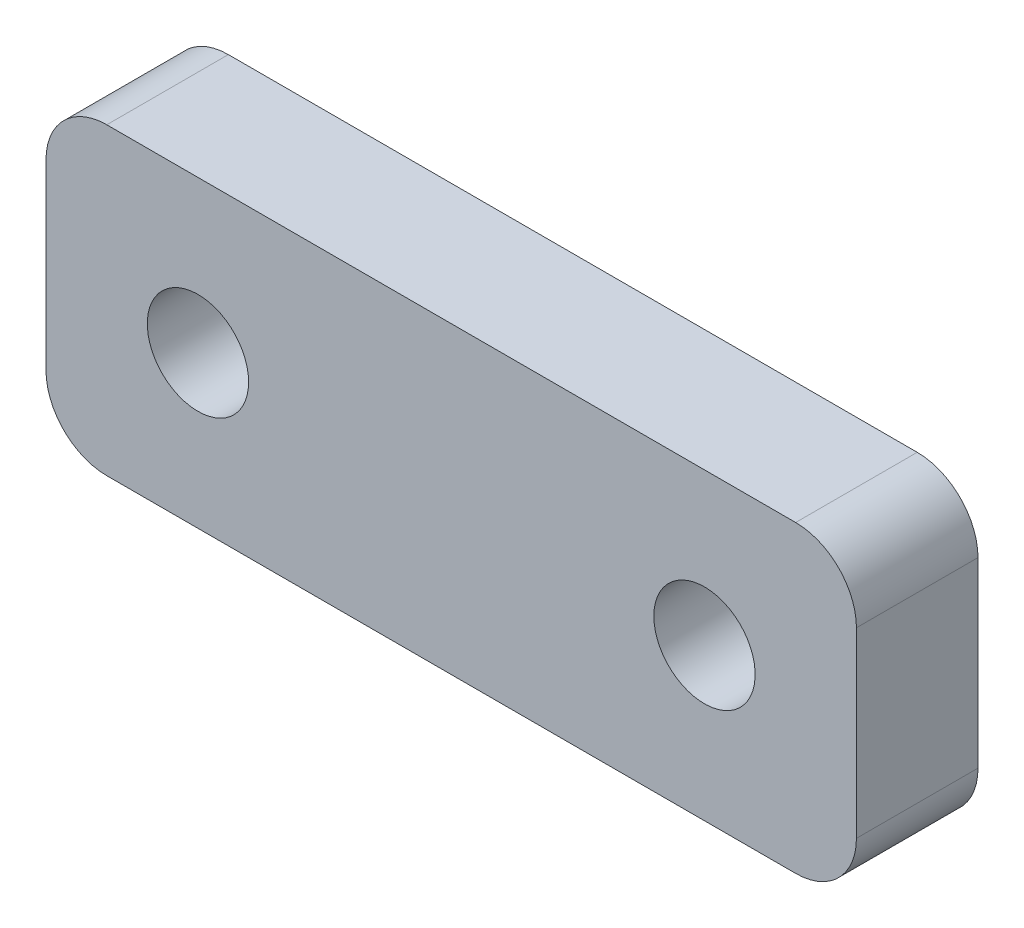
ISO-10303-21;
HEADER;
FILE_DESCRIPTION(('STEP AP214'),'2;1');
FILE_NAME('part.step','',(''),(''),'','','');
FILE_SCHEMA(('AUTOMOTIVE_DESIGN { 1 0 10303 214 1 1 1 1 }'));
ENDSEC;
DATA;
#1=APPLICATION_CONTEXT('core data for automotive mechanical design processes');
#2=APPLICATION_PROTOCOL_DEFINITION('international standard','automotive_design',2000,#1);
#3=PRODUCT_CONTEXT('',#1,'mechanical');
#4=PRODUCT('Part','Part','',(#3));
#5=PRODUCT_RELATED_PRODUCT_CATEGORY('part','',(#4));
#6=PRODUCT_DEFINITION_FORMATION('','',#4);
#7=PRODUCT_DEFINITION_CONTEXT('part definition',#1,'design');
#8=PRODUCT_DEFINITION('design','',#6,#7);
#9=PRODUCT_DEFINITION_SHAPE('','',#8);
#10=(LENGTH_UNIT() NAMED_UNIT(*) SI_UNIT(.MILLI.,.METRE.));
#11=(NAMED_UNIT(*) PLANE_ANGLE_UNIT() SI_UNIT($,.RADIAN.));
#12=(NAMED_UNIT(*) SI_UNIT($,.STERADIAN.) SOLID_ANGLE_UNIT());
#13=UNCERTAINTY_MEASURE_WITH_UNIT(LENGTH_MEASURE(1.E-05),#10,'distance_accuracy_value','');
#14=(GEOMETRIC_REPRESENTATION_CONTEXT(3) GLOBAL_UNCERTAINTY_ASSIGNED_CONTEXT((#13)) GLOBAL_UNIT_ASSIGNED_CONTEXT((#10,
#11,#12)) REPRESENTATION_CONTEXT('',''));
#15=CARTESIAN_POINT('',(0.,0.,0.));
#16=DIRECTION('',(0.,0.,1.));
#17=DIRECTION('',(1.,0.,0.));
#18=AXIS2_PLACEMENT_3D('',#15,#16,#17);
#19=CARTESIAN_POINT('',(20.,7.5,6.));
#20=DIRECTION('',(-1.,0.,0.));
#21=DIRECTION('',(0.,-1.,0.));
#22=AXIS2_PLACEMENT_3D('',#19,#20,#21);
#23=PLANE('',#22);
#24=DIRECTION('',(0.,1.,0.));
#25=VECTOR('',#24,1.);
#26=CARTESIAN_POINT('',(20.,7.5,0.));
#27=LINE('',#26,#25);
#28=CARTESIAN_POINT('',(20.,-4.5,0.));
#29=VERTEX_POINT('',#28);
#30=CARTESIAN_POINT('',(20.,4.5,0.));
#31=VERTEX_POINT('',#30);
#32=EDGE_CURVE('E136',#29,#31,#27,.T.);
#33=ORIENTED_EDGE('',*,*,#32,.T.);
#34=DIRECTION('',(0.,0.,-1.));
#35=VECTOR('',#34,1.);
#36=CARTESIAN_POINT('',(20.,4.5,6.));
#37=LINE('',#36,#35);
#38=CARTESIAN_POINT('',(20.,4.5,6.));
#39=VERTEX_POINT('',#38);
#40=EDGE_CURVE('E111',#31,#39,#37,.F.);
#41=ORIENTED_EDGE('',*,*,#40,.T.);
#42=DIRECTION('',(0.,1.,0.));
#43=VECTOR('',#42,1.);
#44=CARTESIAN_POINT('',(20.,7.5,6.));
#45=LINE('',#44,#43);
#46=CARTESIAN_POINT('',(20.,-4.5,6.));
#47=VERTEX_POINT('',#46);
#48=EDGE_CURVE('E149',#47,#39,#45,.T.);
#49=ORIENTED_EDGE('',*,*,#48,.F.);
#50=DIRECTION('',(0.,0.,-1.));
#51=VECTOR('',#50,1.);
#52=CARTESIAN_POINT('',(20.,-4.5,6.));
#53=LINE('',#52,#51);
#54=EDGE_CURVE('E117',#47,#29,#53,.T.);
#55=ORIENTED_EDGE('',*,*,#54,.T.);
#56=EDGE_LOOP('',(#33,#41,#49,#55));
#57=FACE_BOUND('',#56,.T.);
#58=ADVANCED_FACE('F39',(#57),#23,.F.);
#59=CARTESIAN_POINT('',(-20.,7.5,6.));
#60=DIRECTION('',(0.,-1.,0.));
#61=DIRECTION('',(0.,0.,-1.));
#62=AXIS2_PLACEMENT_3D('',#59,#60,#61);
#63=PLANE('',#62);
#64=DIRECTION('',(-1.,0.,0.));
#65=VECTOR('',#64,1.);
#66=CARTESIAN_POINT('',(-20.,7.5,6.));
#67=LINE('',#66,#65);
#68=CARTESIAN_POINT('',(17.,7.5,6.));
#69=VERTEX_POINT('',#68);
#70=CARTESIAN_POINT('',(-17.,7.5,6.));
#71=VERTEX_POINT('',#70);
#72=EDGE_CURVE('E127',#69,#71,#67,.T.);
#73=ORIENTED_EDGE('',*,*,#72,.F.);
#74=DIRECTION('',(0.,0.,-1.));
#75=VECTOR('',#74,1.);
#76=CARTESIAN_POINT('',(17.,7.5,6.));
#77=LINE('',#76,#75);
#78=CARTESIAN_POINT('',(17.,7.5,0.));
#79=VERTEX_POINT('',#78);
#80=EDGE_CURVE('E110',#69,#79,#77,.T.);
#81=ORIENTED_EDGE('',*,*,#80,.T.);
#82=DIRECTION('',(-1.,0.,0.));
#83=VECTOR('',#82,1.);
#84=CARTESIAN_POINT('',(-20.,7.5,0.));
#85=LINE('',#84,#83);
#86=CARTESIAN_POINT('',(-17.,7.5,0.));
#87=VERTEX_POINT('',#86);
#88=EDGE_CURVE('E124',#79,#87,#85,.T.);
#89=ORIENTED_EDGE('',*,*,#88,.T.);
#90=DIRECTION('',(0.,0.,-1.));
#91=VECTOR('',#90,1.);
#92=CARTESIAN_POINT('',(-17.,7.5,6.));
#93=LINE('',#92,#91);
#94=EDGE_CURVE('E130',#87,#71,#93,.F.);
#95=ORIENTED_EDGE('',*,*,#94,.T.);
#96=EDGE_LOOP('',(#73,#81,#89,#95));
#97=FACE_BOUND('',#96,.T.);
#98=ADVANCED_FACE('F123',(#97),#63,.F.);
#99=CARTESIAN_POINT('',(-20.,7.5,6.));
#100=DIRECTION('',(1.,0.,0.));
#101=DIRECTION('',(0.,0.,-1.));
#102=AXIS2_PLACEMENT_3D('',#99,#100,#101);
#103=PLANE('',#102);
#104=DIRECTION('',(0.,-1.,0.));
#105=VECTOR('',#104,1.);
#106=CARTESIAN_POINT('',(-20.,7.5,0.));
#107=LINE('',#106,#105);
#108=CARTESIAN_POINT('',(-20.,4.5,0.));
#109=VERTEX_POINT('',#108);
#110=CARTESIAN_POINT('',(-20.,-4.5,0.));
#111=VERTEX_POINT('',#110);
#112=EDGE_CURVE('E135',#109,#111,#107,.T.);
#113=ORIENTED_EDGE('',*,*,#112,.T.);
#114=DIRECTION('',(0.,0.,-1.));
#115=VECTOR('',#114,1.);
#116=CARTESIAN_POINT('',(-20.,-4.5,6.));
#117=LINE('',#116,#115);
#118=CARTESIAN_POINT('',(-20.,-4.5,6.));
#119=VERTEX_POINT('',#118);
#120=EDGE_CURVE('E11',#111,#119,#117,.F.);
#121=ORIENTED_EDGE('',*,*,#120,.T.);
#122=DIRECTION('',(0.,-1.,0.));
#123=VECTOR('',#122,1.);
#124=CARTESIAN_POINT('',(-20.,7.5,6.));
#125=LINE('',#124,#123);
#126=CARTESIAN_POINT('',(-20.,4.5,6.));
#127=VERTEX_POINT('',#126);
#128=EDGE_CURVE('E188',#127,#119,#125,.T.);
#129=ORIENTED_EDGE('',*,*,#128,.F.);
#130=DIRECTION('',(0.,0.,-1.));
#131=VECTOR('',#130,1.);
#132=CARTESIAN_POINT('',(-20.,4.5,6.));
#133=LINE('',#132,#131);
#134=EDGE_CURVE('E48',#127,#109,#133,.T.);
#135=ORIENTED_EDGE('',*,*,#134,.T.);
#136=EDGE_LOOP('',(#113,#121,#129,#135));
#137=FACE_BOUND('',#136,.T.);
#138=ADVANCED_FACE('F186',(#137),#103,.F.);
#139=CARTESIAN_POINT('',(-20.,-7.5,6.));
#140=DIRECTION('',(0.,1.,0.));
#141=DIRECTION('',(0.,0.,1.));
#142=AXIS2_PLACEMENT_3D('',#139,#140,#141);
#143=PLANE('',#142);
#144=DIRECTION('',(1.,0.,0.));
#145=VECTOR('',#144,1.);
#146=CARTESIAN_POINT('',(-20.,-7.5,0.));
#147=LINE('',#146,#145);
#148=CARTESIAN_POINT('',(-17.,-7.5,0.));
#149=VERTEX_POINT('',#148);
#150=CARTESIAN_POINT('',(17.,-7.5,0.));
#151=VERTEX_POINT('',#150);
#152=EDGE_CURVE('E141',#149,#151,#147,.T.);
#153=ORIENTED_EDGE('',*,*,#152,.T.);
#154=DIRECTION('',(0.,0.,-1.));
#155=VECTOR('',#154,1.);
#156=CARTESIAN_POINT('',(17.,-7.5,6.));
#157=LINE('',#156,#155);
#158=CARTESIAN_POINT('',(17.,-7.5,6.));
#159=VERTEX_POINT('',#158);
#160=EDGE_CURVE('E55',#151,#159,#157,.F.);
#161=ORIENTED_EDGE('',*,*,#160,.T.);
#162=DIRECTION('',(1.,0.,0.));
#163=VECTOR('',#162,1.);
#164=CARTESIAN_POINT('',(-20.,-7.5,6.));
#165=LINE('',#164,#163);
#166=CARTESIAN_POINT('',(-17.,-7.5,6.));
#167=VERTEX_POINT('',#166);
#168=EDGE_CURVE('E151',#167,#159,#165,.T.);
#169=ORIENTED_EDGE('',*,*,#168,.F.);
#170=DIRECTION('',(0.,0.,-1.));
#171=VECTOR('',#170,1.);
#172=CARTESIAN_POINT('',(-17.,-7.5,6.));
#173=LINE('',#172,#171);
#174=EDGE_CURVE('E176',#167,#149,#173,.T.);
#175=ORIENTED_EDGE('',*,*,#174,.T.);
#176=EDGE_LOOP('',(#153,#161,#169,#175));
#177=FACE_BOUND('',#176,.T.);
#178=ADVANCED_FACE('F195',(#177),#143,.F.);
#179=CARTESIAN_POINT('',(0.,0.,6.));
#180=DIRECTION('',(0.,0.,1.));
#181=DIRECTION('',(1.,0.,0.));
#182=AXIS2_PLACEMENT_3D('',#179,#180,#181);
#183=PLANE('',#182);
#184=CARTESIAN_POINT('',(-12.5,0.,6.));
#185=DIRECTION('',(0.,0.,1.));
#186=DIRECTION('',(1.,0.,0.));
#187=AXIS2_PLACEMENT_3D('',#184,#185,#186);
#188=CIRCLE('',#187,2.5);
#189=CARTESIAN_POINT('',(-10.,0.,6.));
#190=VERTEX_POINT('',#189);
#191=EDGE_CURVE('E214',#190,#190,#188,.T.);
#192=ORIENTED_EDGE('',*,*,#191,.F.);
#193=EDGE_LOOP('',(#192));
#194=FACE_BOUND('',#193,.T.);
#195=CARTESIAN_POINT('',(12.5,0.,6.));
#196=DIRECTION('',(0.,0.,1.));
#197=DIRECTION('',(-1.,0.,0.));
#198=AXIS2_PLACEMENT_3D('',#195,#196,#197);
#199=CIRCLE('',#198,2.5);
#200=CARTESIAN_POINT('',(10.,0.,6.));
#201=VERTEX_POINT('',#200);
#202=EDGE_CURVE('E206',#201,#201,#199,.T.);
#203=ORIENTED_EDGE('',*,*,#202,.F.);
#204=EDGE_LOOP('',(#203));
#205=FACE_BOUND('',#204,.T.);
#206=ORIENTED_EDGE('',*,*,#48,.T.);
#207=CARTESIAN_POINT('',(17.,4.5,6.));
#208=DIRECTION('',(0.,0.,1.));
#209=DIRECTION('',(1.,0.,0.));
#210=AXIS2_PLACEMENT_3D('',#207,#208,#209);
#211=CIRCLE('',#210,3.);
#212=EDGE_CURVE('E173',#39,#69,#211,.T.);
#213=ORIENTED_EDGE('',*,*,#212,.T.);
#214=ORIENTED_EDGE('',*,*,#72,.T.);
#215=CARTESIAN_POINT('',(-17.,4.5,6.));
#216=DIRECTION('',(0.,0.,1.));
#217=DIRECTION('',(1.,0.,0.));
#218=AXIS2_PLACEMENT_3D('',#215,#216,#217);
#219=CIRCLE('',#218,3.);
#220=EDGE_CURVE('E165',#71,#127,#219,.T.);
#221=ORIENTED_EDGE('',*,*,#220,.T.);
#222=ORIENTED_EDGE('',*,*,#128,.T.);
#223=CARTESIAN_POINT('',(-17.,-4.5,6.));
#224=DIRECTION('',(0.,0.,1.));
#225=DIRECTION('',(1.,0.,0.));
#226=AXIS2_PLACEMENT_3D('',#223,#224,#225);
#227=CIRCLE('',#226,3.);
#228=EDGE_CURVE('E62',#119,#167,#227,.T.);
#229=ORIENTED_EDGE('',*,*,#228,.T.);
#230=ORIENTED_EDGE('',*,*,#168,.T.);
#231=CARTESIAN_POINT('',(17.,-4.5,6.));
#232=DIRECTION('',(0.,0.,1.));
#233=DIRECTION('',(1.,0.,0.));
#234=AXIS2_PLACEMENT_3D('',#231,#232,#233);
#235=CIRCLE('',#234,3.);
#236=EDGE_CURVE('E170',#159,#47,#235,.T.);
#237=ORIENTED_EDGE('',*,*,#236,.T.);
#238=EDGE_LOOP('',(#206,#213,#214,#221,#222,#229,#230,#237));
#239=FACE_BOUND('',#238,.T.);
#240=ADVANCED_FACE('F231',(#194,#205,#239),#183,.T.);
#241=CARTESIAN_POINT('',(0.,0.,0.));
#242=DIRECTION('',(0.,0.,1.));
#243=DIRECTION('',(1.,0.,0.));
#244=AXIS2_PLACEMENT_3D('',#241,#242,#243);
#245=PLANE('',#244);
#246=CARTESIAN_POINT('',(-12.5,0.,0.));
#247=DIRECTION('',(0.,0.,1.));
#248=DIRECTION('',(1.,0.,0.));
#249=AXIS2_PLACEMENT_3D('',#246,#247,#248);
#250=CIRCLE('',#249,2.5);
#251=CARTESIAN_POINT('',(-10.,0.,0.));
#252=VERTEX_POINT('',#251);
#253=EDGE_CURVE('E143',#252,#252,#250,.T.);
#254=ORIENTED_EDGE('',*,*,#253,.T.);
#255=EDGE_LOOP('',(#254));
#256=FACE_BOUND('',#255,.T.);
#257=CARTESIAN_POINT('',(12.5,0.,0.));
#258=DIRECTION('',(0.,0.,1.));
#259=DIRECTION('',(-1.,0.,0.));
#260=AXIS2_PLACEMENT_3D('',#257,#258,#259);
#261=CIRCLE('',#260,2.5);
#262=CARTESIAN_POINT('',(10.,0.,0.));
#263=VERTEX_POINT('',#262);
#264=EDGE_CURVE('E210',#263,#263,#261,.T.);
#265=ORIENTED_EDGE('',*,*,#264,.T.);
#266=EDGE_LOOP('',(#265));
#267=FACE_BOUND('',#266,.T.);
#268=ORIENTED_EDGE('',*,*,#88,.F.);
#269=CARTESIAN_POINT('',(17.,4.5,0.));
#270=DIRECTION('',(0.,0.,1.));
#271=DIRECTION('',(1.,0.,0.));
#272=AXIS2_PLACEMENT_3D('',#269,#270,#271);
#273=CIRCLE('',#272,3.);
#274=EDGE_CURVE('E106',#79,#31,#273,.F.);
#275=ORIENTED_EDGE('',*,*,#274,.T.);
#276=ORIENTED_EDGE('',*,*,#32,.F.);
#277=CARTESIAN_POINT('',(17.,-4.5,0.));
#278=DIRECTION('',(0.,0.,1.));
#279=DIRECTION('',(1.,0.,0.));
#280=AXIS2_PLACEMENT_3D('',#277,#278,#279);
#281=CIRCLE('',#280,3.);
#282=EDGE_CURVE('E118',#29,#151,#281,.F.);
#283=ORIENTED_EDGE('',*,*,#282,.T.);
#284=ORIENTED_EDGE('',*,*,#152,.F.);
#285=CARTESIAN_POINT('',(-17.,-4.5,0.));
#286=DIRECTION('',(0.,0.,1.));
#287=DIRECTION('',(1.,0.,0.));
#288=AXIS2_PLACEMENT_3D('',#285,#286,#287);
#289=CIRCLE('',#288,3.);
#290=EDGE_CURVE('E155',#149,#111,#289,.F.);
#291=ORIENTED_EDGE('',*,*,#290,.T.);
#292=ORIENTED_EDGE('',*,*,#112,.F.);
#293=CARTESIAN_POINT('',(-17.,4.5,0.));
#294=DIRECTION('',(0.,0.,1.));
#295=DIRECTION('',(1.,0.,0.));
#296=AXIS2_PLACEMENT_3D('',#293,#294,#295);
#297=CIRCLE('',#296,3.);
#298=EDGE_CURVE('E129',#109,#87,#297,.F.);
#299=ORIENTED_EDGE('',*,*,#298,.T.);
#300=EDGE_LOOP('',(#268,#275,#276,#283,#284,#291,#292,#299));
#301=FACE_BOUND('',#300,.T.);
#302=ADVANCED_FACE('F132',(#256,#267,#301),#245,.F.);
#303=CARTESIAN_POINT('',(12.5,0.,0.));
#304=DIRECTION('',(0.,0.,1.));
#305=DIRECTION('',(1.,0.,0.));
#306=AXIS2_PLACEMENT_3D('',#303,#304,#305);
#307=CYLINDRICAL_SURFACE('',#306,2.5);
#308=ORIENTED_EDGE('',*,*,#264,.F.);
#309=EDGE_LOOP('',(#308));
#310=FACE_BOUND('',#309,.T.);
#311=ORIENTED_EDGE('',*,*,#202,.T.);
#312=EDGE_LOOP('',(#311));
#313=FACE_BOUND('',#312,.T.);
#314=ADVANCED_FACE('F227',(#310,#313),#307,.F.);
#315=CARTESIAN_POINT('',(-12.5,0.,0.));
#316=DIRECTION('',(0.,0.,1.));
#317=DIRECTION('',(1.,0.,0.));
#318=AXIS2_PLACEMENT_3D('',#315,#316,#317);
#319=CYLINDRICAL_SURFACE('',#318,2.5);
#320=ORIENTED_EDGE('',*,*,#253,.F.);
#321=EDGE_LOOP('',(#320));
#322=FACE_BOUND('',#321,.T.);
#323=ORIENTED_EDGE('',*,*,#191,.T.);
#324=EDGE_LOOP('',(#323));
#325=FACE_BOUND('',#324,.T.);
#326=ADVANCED_FACE('F224',(#322,#325),#319,.F.);
#327=CARTESIAN_POINT('',(17.,4.5,6.));
#328=DIRECTION('',(0.,0.,-1.));
#329=DIRECTION('',(-1.,0.,0.));
#330=AXIS2_PLACEMENT_3D('',#327,#328,#329);
#331=CYLINDRICAL_SURFACE('',#330,3.);
#332=ORIENTED_EDGE('',*,*,#212,.F.);
#333=ORIENTED_EDGE('',*,*,#40,.F.);
#334=ORIENTED_EDGE('',*,*,#274,.F.);
#335=ORIENTED_EDGE('',*,*,#80,.F.);
#336=EDGE_LOOP('',(#332,#333,#334,#335));
#337=FACE_BOUND('',#336,.T.);
#338=ADVANCED_FACE('F109',(#337),#331,.T.);
#339=CARTESIAN_POINT('',(17.,-4.5,6.));
#340=DIRECTION('',(0.,0.,-1.));
#341=DIRECTION('',(-1.,0.,0.));
#342=AXIS2_PLACEMENT_3D('',#339,#340,#341);
#343=CYLINDRICAL_SURFACE('',#342,3.);
#344=ORIENTED_EDGE('',*,*,#236,.F.);
#345=ORIENTED_EDGE('',*,*,#160,.F.);
#346=ORIENTED_EDGE('',*,*,#282,.F.);
#347=ORIENTED_EDGE('',*,*,#54,.F.);
#348=EDGE_LOOP('',(#344,#345,#346,#347));
#349=FACE_BOUND('',#348,.T.);
#350=ADVANCED_FACE('F240',(#349),#343,.T.);
#351=CARTESIAN_POINT('',(-17.,-4.5,6.));
#352=DIRECTION('',(0.,0.,-1.));
#353=DIRECTION('',(-1.,0.,0.));
#354=AXIS2_PLACEMENT_3D('',#351,#352,#353);
#355=CYLINDRICAL_SURFACE('',#354,3.);
#356=ORIENTED_EDGE('',*,*,#228,.F.);
#357=ORIENTED_EDGE('',*,*,#120,.F.);
#358=ORIENTED_EDGE('',*,*,#290,.F.);
#359=ORIENTED_EDGE('',*,*,#174,.F.);
#360=EDGE_LOOP('',(#356,#357,#358,#359));
#361=FACE_BOUND('',#360,.T.);
#362=ADVANCED_FACE('F194',(#361),#355,.T.);
#363=CARTESIAN_POINT('',(-17.,4.5,6.));
#364=DIRECTION('',(0.,0.,-1.));
#365=DIRECTION('',(-1.,0.,0.));
#366=AXIS2_PLACEMENT_3D('',#363,#364,#365);
#367=CYLINDRICAL_SURFACE('',#366,3.);
#368=ORIENTED_EDGE('',*,*,#220,.F.);
#369=ORIENTED_EDGE('',*,*,#94,.F.);
#370=ORIENTED_EDGE('',*,*,#298,.F.);
#371=ORIENTED_EDGE('',*,*,#134,.F.);
#372=EDGE_LOOP('',(#368,#369,#370,#371));
#373=FACE_BOUND('',#372,.T.);
#374=ADVANCED_FACE('F41',(#373),#367,.T.);
#375=CLOSED_SHELL('',(#58,#98,#138,#178,#240,#302,#314,#326,#338,#350,#362,#374));
#376=MANIFOLD_SOLID_BREP('B2',#375);
#377=ADVANCED_BREP_SHAPE_REPRESENTATION('',(#18,#376),#14);
#378=SHAPE_DEFINITION_REPRESENTATION(#9,#377);
ENDSEC;
END-ISO-10303-21;
